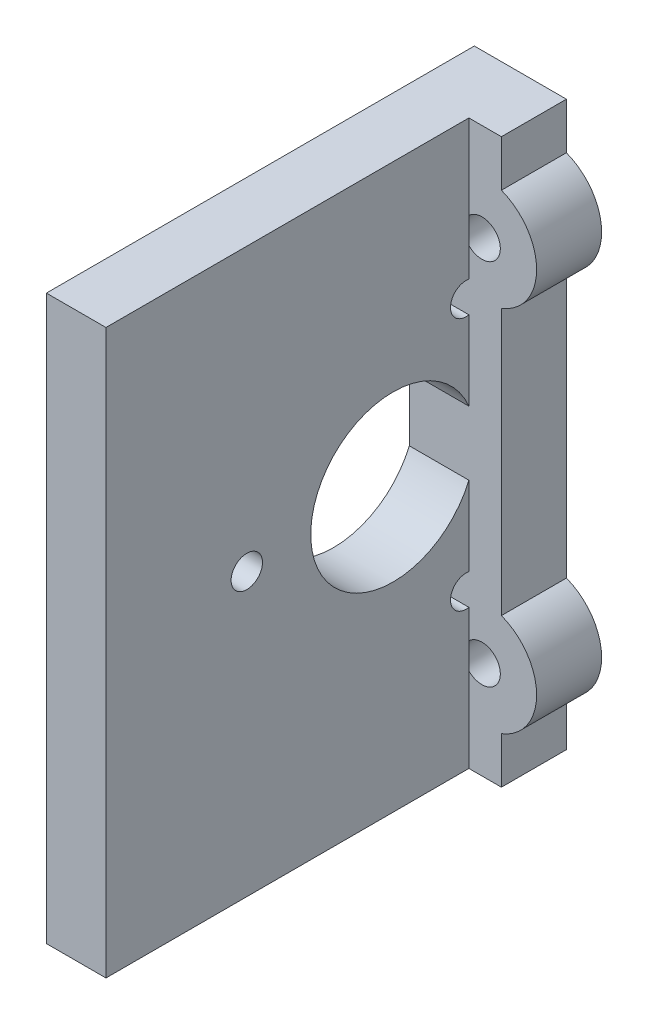
ISO-10303-21;
HEADER;
FILE_DESCRIPTION(('STEP AP214'),'2;1');
FILE_NAME('part.step','',(''),(''),'','','');
FILE_SCHEMA(('AUTOMOTIVE_DESIGN { 1 0 10303 214 1 1 1 1 }'));
ENDSEC;
DATA;
#1=APPLICATION_CONTEXT('core data for automotive mechanical design processes');
#2=APPLICATION_PROTOCOL_DEFINITION('international standard','automotive_design',2000,#1);
#3=PRODUCT_CONTEXT('',#1,'mechanical');
#4=PRODUCT('Part','Part','',(#3));
#5=PRODUCT_RELATED_PRODUCT_CATEGORY('part','',(#4));
#6=PRODUCT_DEFINITION_FORMATION('','',#4);
#7=PRODUCT_DEFINITION_CONTEXT('part definition',#1,'design');
#8=PRODUCT_DEFINITION('design','',#6,#7);
#9=PRODUCT_DEFINITION_SHAPE('','',#8);
#10=(LENGTH_UNIT() NAMED_UNIT(*) SI_UNIT(.MILLI.,.METRE.));
#11=(NAMED_UNIT(*) PLANE_ANGLE_UNIT() SI_UNIT($,.RADIAN.));
#12=(NAMED_UNIT(*) SI_UNIT($,.STERADIAN.) SOLID_ANGLE_UNIT());
#13=UNCERTAINTY_MEASURE_WITH_UNIT(LENGTH_MEASURE(1.E-05),#10,'distance_accuracy_value','');
#14=(GEOMETRIC_REPRESENTATION_CONTEXT(3) GLOBAL_UNCERTAINTY_ASSIGNED_CONTEXT((#13)) GLOBAL_UNIT_ASSIGNED_CONTEXT((#10,
#11,#12)) REPRESENTATION_CONTEXT('',''));
#15=CARTESIAN_POINT('',(0.,0.,0.));
#16=DIRECTION('',(0.,0.,1.));
#17=DIRECTION('',(1.,0.,0.));
#18=AXIS2_PLACEMENT_3D('',#15,#16,#17);
#19=CARTESIAN_POINT('',(272.5,274.,293.));
#20=DIRECTION('',(-1.,0.,0.));
#21=DIRECTION('',(0.,0.,1.));
#22=AXIS2_PLACEMENT_3D('',#19,#20,#21);
#23=PLANE('',#22);
#24=DIRECTION('',(0.,0.,-1.));
#25=VECTOR('',#24,1.);
#26=CARTESIAN_POINT('',(272.5,321.718315377335,293.));
#27=LINE('',#26,#25);
#28=CARTESIAN_POINT('',(272.5,321.718315377335,287.));
#29=VERTEX_POINT('',#28);
#30=CARTESIAN_POINT('',(272.5,321.718315377335,293.));
#31=VERTEX_POINT('',#30);
#32=EDGE_CURVE('E290',#29,#31,#27,.F.);
#33=ORIENTED_EDGE('',*,*,#32,.F.);
#34=DIRECTION('',(0.,1.,0.));
#35=VECTOR('',#34,1.);
#36=CARTESIAN_POINT('',(272.5,274.,287.));
#37=LINE('',#36,#35);
#38=CARTESIAN_POINT('',(272.5,326.,287.));
#39=VERTEX_POINT('',#38);
#40=EDGE_CURVE('E285',#29,#39,#37,.T.);
#41=ORIENTED_EDGE('',*,*,#40,.T.);
#42=DIRECTION('',(0.,0.,-1.));
#43=VECTOR('',#42,1.);
#44=CARTESIAN_POINT('',(272.5,326.,293.));
#45=LINE('',#44,#43);
#46=CARTESIAN_POINT('',(272.5,326.,293.));
#47=VERTEX_POINT('',#46);
#48=EDGE_CURVE('E304',#47,#39,#45,.T.);
#49=ORIENTED_EDGE('',*,*,#48,.F.);
#50=DIRECTION('',(0.,1.,0.));
#51=VECTOR('',#50,1.);
#52=CARTESIAN_POINT('',(272.5,274.,293.));
#53=LINE('',#52,#51);
#54=EDGE_CURVE('E302',#31,#47,#53,.T.);
#55=ORIENTED_EDGE('',*,*,#54,.F.);
#56=EDGE_LOOP('',(#33,#41,#49,#55));
#57=FACE_BOUND('',#56,.T.);
#58=ADVANCED_FACE('F39',(#57),#23,.F.);
#59=DIRECTION('',(0.,0.,-1.));
#60=VECTOR('',#59,1.);
#61=CARTESIAN_POINT('',(272.5,312.281684622665,293.));
#62=LINE('',#61,#60);
#63=CARTESIAN_POINT('',(272.5,312.281684622665,293.));
#64=VERTEX_POINT('',#63);
#65=CARTESIAN_POINT('',(272.5,312.281684622665,287.));
#66=VERTEX_POINT('',#65);
#67=EDGE_CURVE('E323',#64,#66,#62,.T.);
#68=ORIENTED_EDGE('',*,*,#67,.F.);
#69=CARTESIAN_POINT('',(272.5,287.718315377335,293.));
#70=VERTEX_POINT('',#69);
#71=EDGE_CURVE('E281',#70,#64,#53,.T.);
#72=ORIENTED_EDGE('',*,*,#71,.F.);
#73=DIRECTION('',(0.,0.,-1.));
#74=VECTOR('',#73,1.);
#75=CARTESIAN_POINT('',(272.5,287.718315377335,293.));
#76=LINE('',#75,#74);
#77=CARTESIAN_POINT('',(272.5,287.718315377335,287.));
#78=VERTEX_POINT('',#77);
#79=EDGE_CURVE('E168',#78,#70,#76,.F.);
#80=ORIENTED_EDGE('',*,*,#79,.F.);
#81=EDGE_CURVE('E287',#78,#66,#37,.T.);
#82=ORIENTED_EDGE('',*,*,#81,.T.);
#83=EDGE_LOOP('',(#68,#72,#80,#82));
#84=FACE_BOUND('',#83,.T.);
#85=ADVANCED_FACE('F322',(#84),#23,.F.);
#86=DIRECTION('',(0.,0.,-1.));
#87=VECTOR('',#86,1.);
#88=CARTESIAN_POINT('',(272.5,278.281684622665,293.));
#89=LINE('',#88,#87);
#90=CARTESIAN_POINT('',(272.5,278.281684622665,293.));
#91=VERTEX_POINT('',#90);
#92=CARTESIAN_POINT('',(272.5,278.281684622665,287.));
#93=VERTEX_POINT('',#92);
#94=EDGE_CURVE('E264',#91,#93,#89,.T.);
#95=ORIENTED_EDGE('',*,*,#94,.F.);
#96=CARTESIAN_POINT('',(272.5,274.,293.));
#97=VERTEX_POINT('',#96);
#98=EDGE_CURVE('E284',#97,#91,#53,.T.);
#99=ORIENTED_EDGE('',*,*,#98,.F.);
#100=DIRECTION('',(0.,0.,-1.));
#101=VECTOR('',#100,1.);
#102=CARTESIAN_POINT('',(272.5,274.,293.));
#103=LINE('',#102,#101);
#104=CARTESIAN_POINT('',(272.5,274.,287.));
#105=VERTEX_POINT('',#104);
#106=EDGE_CURVE('E196',#97,#105,#103,.T.);
#107=ORIENTED_EDGE('',*,*,#106,.T.);
#108=EDGE_CURVE('E289',#105,#93,#37,.T.);
#109=ORIENTED_EDGE('',*,*,#108,.T.);
#110=EDGE_LOOP('',(#95,#99,#107,#109));
#111=FACE_BOUND('',#110,.T.);
#112=ADVANCED_FACE('F312',(#111),#23,.F.);
#113=CARTESIAN_POINT('',(269.5,0.,0.));
#114=DIRECTION('',(-1.,0.,0.));
#115=DIRECTION('',(0.,0.,1.));
#116=AXIS2_PLACEMENT_3D('',#113,#114,#115);
#117=PLANE('',#116);
#118=CARTESIAN_POINT('',(269.5,300.,313.5));
#119=DIRECTION('',(1.,0.,0.));
#120=DIRECTION('',(0.,0.,-1.));
#121=AXIS2_PLACEMENT_3D('',#118,#119,#120);
#122=CIRCLE('',#121,1.45000000000001);
#123=CARTESIAN_POINT('',(269.5,300.,312.05));
#124=VERTEX_POINT('',#123);
#125=EDGE_CURVE('E226',#124,#124,#122,.T.);
#126=ORIENTED_EDGE('',*,*,#125,.F.);
#127=EDGE_LOOP('',(#126));
#128=FACE_BOUND('',#127,.T.);
#129=DIRECTION('',(0.,0.,-1.));
#130=VECTOR('',#129,1.);
#131=CARTESIAN_POINT('',(269.5,274.,287.));
#132=LINE('',#131,#130);
#133=CARTESIAN_POINT('',(269.5,274.,326.5));
#134=VERTEX_POINT('',#133);
#135=CARTESIAN_POINT('',(269.5,274.,293.));
#136=VERTEX_POINT('',#135);
#137=EDGE_CURVE('E237',#134,#136,#132,.T.);
#138=ORIENTED_EDGE('',*,*,#137,.T.);
#139=DIRECTION('',(0.,1.,0.));
#140=VECTOR('',#139,1.);
#141=CARTESIAN_POINT('',(269.5,0.,293.));
#142=LINE('',#141,#140);
#143=CARTESIAN_POINT('',(269.5,281.795840542121,293.));
#144=VERTEX_POINT('',#143);
#145=EDGE_CURVE('E190',#136,#144,#142,.T.);
#146=ORIENTED_EDGE('',*,*,#145,.T.);
#147=CARTESIAN_POINT('',(269.5,284.204159457879,293.));
#148=VERTEX_POINT('',#147);
#149=EDGE_CURVE('E185',#144,#148,#142,.T.);
#150=ORIENTED_EDGE('',*,*,#149,.T.);
#151=CARTESIAN_POINT('',(269.5,286.880371363202,293.));
#152=VERTEX_POINT('',#151);
#153=EDGE_CURVE('E197',#148,#152,#142,.T.);
#154=ORIENTED_EDGE('',*,*,#153,.T.);
#155=CARTESIAN_POINT('',(269.5,288.30865704891,293.25));
#156=DIRECTION('',(1.,0.,0.));
#157=DIRECTION('',(0.,0.,-1.));
#158=AXIS2_PLACEMENT_3D('',#155,#156,#157);
#159=CIRCLE('',#158,1.45000000000001);
#160=CARTESIAN_POINT('',(269.5,289.736942734619,293.));
#161=VERTEX_POINT('',#160);
#162=EDGE_CURVE('E214',#161,#152,#159,.T.);
#163=ORIENTED_EDGE('',*,*,#162,.F.);
#164=CARTESIAN_POINT('',(269.5,297.04027028261,293.));
#165=VERTEX_POINT('',#164);
#166=EDGE_CURVE('E191',#161,#165,#142,.T.);
#167=ORIENTED_EDGE('',*,*,#166,.T.);
#168=CARTESIAN_POINT('',(269.5,300.,300.));
#169=DIRECTION('',(1.,0.,0.));
#170=DIRECTION('',(0.,0.,-1.));
#171=AXIS2_PLACEMENT_3D('',#168,#169,#170);
#172=CIRCLE('',#171,7.6);
#173=CARTESIAN_POINT('',(269.5,302.95972971739,293.));
#174=VERTEX_POINT('',#173);
#175=EDGE_CURVE('E209',#174,#165,#172,.T.);
#176=ORIENTED_EDGE('',*,*,#175,.F.);
#177=CARTESIAN_POINT('',(269.5,310.263057265381,293.));
#178=VERTEX_POINT('',#177);
#179=EDGE_CURVE('E198',#174,#178,#142,.T.);
#180=ORIENTED_EDGE('',*,*,#179,.T.);
#181=CARTESIAN_POINT('',(269.5,311.69134295109,293.25));
#182=DIRECTION('',(1.,0.,0.));
#183=DIRECTION('',(0.,0.,-1.));
#184=AXIS2_PLACEMENT_3D('',#181,#182,#183);
#185=CIRCLE('',#184,1.45000000000001);
#186=CARTESIAN_POINT('',(269.5,313.119628636799,293.));
#187=VERTEX_POINT('',#186);
#188=EDGE_CURVE('E220',#187,#178,#185,.T.);
#189=ORIENTED_EDGE('',*,*,#188,.F.);
#190=CARTESIAN_POINT('',(269.5,315.795840542121,293.));
#191=VERTEX_POINT('',#190);
#192=EDGE_CURVE('E188',#187,#191,#142,.T.);
#193=ORIENTED_EDGE('',*,*,#192,.T.);
#194=CARTESIAN_POINT('',(269.5,318.204159457879,293.));
#195=VERTEX_POINT('',#194);
#196=EDGE_CURVE('E172',#191,#195,#142,.T.);
#197=ORIENTED_EDGE('',*,*,#196,.T.);
#198=CARTESIAN_POINT('',(269.5,326.,293.));
#199=VERTEX_POINT('',#198);
#200=EDGE_CURVE('E176',#195,#199,#142,.T.);
#201=ORIENTED_EDGE('',*,*,#200,.T.);
#202=DIRECTION('',(0.,0.,1.));
#203=VECTOR('',#202,1.);
#204=CARTESIAN_POINT('',(269.5,326.,326.5));
#205=LINE('',#204,#203);
#206=CARTESIAN_POINT('',(269.5,326.,326.5));
#207=VERTEX_POINT('',#206);
#208=EDGE_CURVE('E232',#199,#207,#205,.T.);
#209=ORIENTED_EDGE('',*,*,#208,.T.);
#210=DIRECTION('',(0.,-1.,0.));
#211=VECTOR('',#210,1.);
#212=CARTESIAN_POINT('',(269.5,274.,326.5));
#213=LINE('',#212,#211);
#214=EDGE_CURVE('E234',#207,#134,#213,.T.);
#215=ORIENTED_EDGE('',*,*,#214,.T.);
#216=EDGE_LOOP('',(#138,#146,#150,#154,#163,#167,#176,#180,#189,#193,#197,#201,#209,#215));
#217=FACE_BOUND('',#216,.T.);
#218=ADVANCED_FACE('F186',(#128,#217),#117,.F.);
#219=CARTESIAN_POINT('',(264.,0.,0.));
#220=DIRECTION('',(-1.,0.,0.));
#221=DIRECTION('',(0.,0.,1.));
#222=AXIS2_PLACEMENT_3D('',#219,#220,#221);
#223=PLANE('',#222);
#224=CARTESIAN_POINT('',(264.,288.30865704891,293.25));
#225=DIRECTION('',(1.,0.,0.));
#226=DIRECTION('',(0.,0.,-1.));
#227=AXIS2_PLACEMENT_3D('',#224,#225,#226);
#228=CIRCLE('',#227,1.45000000000001);
#229=CARTESIAN_POINT('',(264.,289.736942734619,293.));
#230=VERTEX_POINT('',#229);
#231=CARTESIAN_POINT('',(264.,286.880371363202,293.));
#232=VERTEX_POINT('',#231);
#233=EDGE_CURVE('E211',#230,#232,#228,.T.);
#234=ORIENTED_EDGE('',*,*,#233,.T.);
#235=DIRECTION('',(0.,-1.,0.));
#236=VECTOR('',#235,1.);
#237=CARTESIAN_POINT('',(264.,326.,293.));
#238=LINE('',#237,#236);
#239=EDGE_CURVE('E295',#230,#232,#238,.T.);
#240=ORIENTED_EDGE('',*,*,#239,.F.);
#241=EDGE_LOOP('',(#234,#240));
#242=FACE_BOUND('',#241,.T.);
#243=CARTESIAN_POINT('',(264.,300.,300.));
#244=DIRECTION('',(1.,0.,0.));
#245=DIRECTION('',(0.,0.,-1.));
#246=AXIS2_PLACEMENT_3D('',#243,#244,#245);
#247=CIRCLE('',#246,7.6);
#248=CARTESIAN_POINT('',(264.,302.95972971739,293.));
#249=VERTEX_POINT('',#248);
#250=CARTESIAN_POINT('',(264.,297.04027028261,293.));
#251=VERTEX_POINT('',#250);
#252=EDGE_CURVE('E189',#249,#251,#247,.T.);
#253=ORIENTED_EDGE('',*,*,#252,.T.);
#254=EDGE_CURVE('E298',#249,#251,#238,.T.);
#255=ORIENTED_EDGE('',*,*,#254,.F.);
#256=EDGE_LOOP('',(#253,#255));
#257=FACE_BOUND('',#256,.T.);
#258=CARTESIAN_POINT('',(264.,311.69134295109,293.25));
#259=DIRECTION('',(1.,0.,0.));
#260=DIRECTION('',(0.,0.,-1.));
#261=AXIS2_PLACEMENT_3D('',#258,#259,#260);
#262=CIRCLE('',#261,1.45000000000001);
#263=CARTESIAN_POINT('',(264.,313.119628636799,293.));
#264=VERTEX_POINT('',#263);
#265=CARTESIAN_POINT('',(264.,310.263057265381,293.));
#266=VERTEX_POINT('',#265);
#267=EDGE_CURVE('E217',#264,#266,#262,.T.);
#268=ORIENTED_EDGE('',*,*,#267,.T.);
#269=EDGE_CURVE('E299',#264,#266,#238,.T.);
#270=ORIENTED_EDGE('',*,*,#269,.F.);
#271=EDGE_LOOP('',(#268,#270));
#272=FACE_BOUND('',#271,.T.);
#273=DIRECTION('',(0.,1.,0.));
#274=VECTOR('',#273,1.);
#275=CARTESIAN_POINT('',(264.,326.,287.));
#276=LINE('',#275,#274);
#277=CARTESIAN_POINT('',(264.,274.,287.));
#278=VERTEX_POINT('',#277);
#279=CARTESIAN_POINT('',(264.,326.,287.));
#280=VERTEX_POINT('',#279);
#281=EDGE_CURVE('E229',#278,#280,#276,.T.);
#282=ORIENTED_EDGE('',*,*,#281,.F.);
#283=DIRECTION('',(0.,0.,-1.));
#284=VECTOR('',#283,1.);
#285=CARTESIAN_POINT('',(264.,274.,287.));
#286=LINE('',#285,#284);
#287=CARTESIAN_POINT('',(264.,274.,326.5));
#288=VERTEX_POINT('',#287);
#289=EDGE_CURVE('E235',#288,#278,#286,.T.);
#290=ORIENTED_EDGE('',*,*,#289,.F.);
#291=DIRECTION('',(0.,-1.,0.));
#292=VECTOR('',#291,1.);
#293=CARTESIAN_POINT('',(264.,274.,326.5));
#294=LINE('',#293,#292);
#295=CARTESIAN_POINT('',(264.,326.,326.5));
#296=VERTEX_POINT('',#295);
#297=EDGE_CURVE('E244',#296,#288,#294,.T.);
#298=ORIENTED_EDGE('',*,*,#297,.F.);
#299=DIRECTION('',(0.,0.,1.));
#300=VECTOR('',#299,1.);
#301=CARTESIAN_POINT('',(264.,326.,326.5));
#302=LINE('',#301,#300);
#303=EDGE_CURVE('E242',#280,#296,#302,.T.);
#304=ORIENTED_EDGE('',*,*,#303,.F.);
#305=EDGE_LOOP('',(#282,#290,#298,#304));
#306=FACE_BOUND('',#305,.T.);
#307=CARTESIAN_POINT('',(264.,300.,313.5));
#308=DIRECTION('',(1.,0.,0.));
#309=DIRECTION('',(0.,0.,-1.));
#310=AXIS2_PLACEMENT_3D('',#307,#308,#309);
#311=CIRCLE('',#310,1.45000000000001);
#312=CARTESIAN_POINT('',(264.,300.,312.05));
#313=VERTEX_POINT('',#312);
#314=EDGE_CURVE('E223',#313,#313,#311,.T.);
#315=ORIENTED_EDGE('',*,*,#314,.T.);
#316=EDGE_LOOP('',(#315));
#317=FACE_BOUND('',#316,.T.);
#318=ADVANCED_FACE('F365',(#242,#257,#272,#306,#317),#223,.T.);
#319=CARTESIAN_POINT('',(269.5,326.,287.));
#320=DIRECTION('',(0.,0.,1.));
#321=DIRECTION('',(1.,0.,0.));
#322=AXIS2_PLACEMENT_3D('',#319,#320,#321);
#323=PLANE('',#322);
#324=CARTESIAN_POINT('',(270.7,283.,287.));
#325=DIRECTION('',(0.,0.,1.));
#326=DIRECTION('',(1.,0.,0.));
#327=AXIS2_PLACEMENT_3D('',#324,#325,#326);
#328=CIRCLE('',#327,1.69999999999998);
#329=CARTESIAN_POINT('',(272.4,283.,287.));
#330=VERTEX_POINT('',#329);
#331=EDGE_CURVE('E333',#330,#330,#328,.T.);
#332=ORIENTED_EDGE('',*,*,#331,.T.);
#333=EDGE_LOOP('',(#332));
#334=FACE_BOUND('',#333,.T.);
#335=CARTESIAN_POINT('',(270.7,317.,287.));
#336=DIRECTION('',(0.,0.,1.));
#337=DIRECTION('',(1.,0.,0.));
#338=AXIS2_PLACEMENT_3D('',#335,#336,#337);
#339=CIRCLE('',#338,1.69999999999998);
#340=CARTESIAN_POINT('',(272.4,317.,287.));
#341=VERTEX_POINT('',#340);
#342=EDGE_CURVE('E173',#341,#341,#339,.T.);
#343=ORIENTED_EDGE('',*,*,#342,.T.);
#344=EDGE_LOOP('',(#343));
#345=FACE_BOUND('',#344,.T.);
#346=ORIENTED_EDGE('',*,*,#40,.F.);
#347=CARTESIAN_POINT('',(270.7,317.,287.));
#348=DIRECTION('',(0.,0.,1.));
#349=DIRECTION('',(1.,0.,0.));
#350=AXIS2_PLACEMENT_3D('',#347,#348,#349);
#351=CIRCLE('',#350,5.05);
#352=EDGE_CURVE('E320',#66,#29,#351,.T.);
#353=ORIENTED_EDGE('',*,*,#352,.F.);
#354=ORIENTED_EDGE('',*,*,#81,.F.);
#355=CARTESIAN_POINT('',(270.7,283.,287.));
#356=DIRECTION('',(0.,0.,1.));
#357=DIRECTION('',(1.,0.,0.));
#358=AXIS2_PLACEMENT_3D('',#355,#356,#357);
#359=CIRCLE('',#358,5.05);
#360=EDGE_CURVE('E275',#93,#78,#359,.T.);
#361=ORIENTED_EDGE('',*,*,#360,.F.);
#362=ORIENTED_EDGE('',*,*,#108,.F.);
#363=DIRECTION('',(-1.,0.,0.));
#364=VECTOR('',#363,1.);
#365=CARTESIAN_POINT('',(269.5,274.,287.));
#366=LINE('',#365,#364);
#367=EDGE_CURVE('E239',#105,#278,#366,.T.);
#368=ORIENTED_EDGE('',*,*,#367,.T.);
#369=ORIENTED_EDGE('',*,*,#281,.T.);
#370=DIRECTION('',(-1.,0.,0.));
#371=VECTOR('',#370,1.);
#372=CARTESIAN_POINT('',(269.5,326.,287.));
#373=LINE('',#372,#371);
#374=EDGE_CURVE('E255',#39,#280,#373,.T.);
#375=ORIENTED_EDGE('',*,*,#374,.F.);
#376=EDGE_LOOP('',(#346,#353,#354,#361,#362,#368,#369,#375));
#377=FACE_BOUND('',#376,.T.);
#378=ADVANCED_FACE('F41',(#334,#345,#377),#323,.F.);
#379=CARTESIAN_POINT('',(269.5,326.,326.5));
#380=DIRECTION('',(0.,-1.,0.));
#381=DIRECTION('',(0.,0.,-1.));
#382=AXIS2_PLACEMENT_3D('',#379,#380,#381);
#383=PLANE('',#382);
#384=ORIENTED_EDGE('',*,*,#208,.F.);
#385=DIRECTION('',(-1.,0.,0.));
#386=VECTOR('',#385,1.);
#387=CARTESIAN_POINT('',(272.5,326.,293.));
#388=LINE('',#387,#386);
#389=EDGE_CURVE('E180',#47,#199,#388,.T.);
#390=ORIENTED_EDGE('',*,*,#389,.F.);
#391=ORIENTED_EDGE('',*,*,#48,.T.);
#392=ORIENTED_EDGE('',*,*,#374,.T.);
#393=ORIENTED_EDGE('',*,*,#303,.T.);
#394=DIRECTION('',(-1.,0.,0.));
#395=VECTOR('',#394,1.);
#396=CARTESIAN_POINT('',(269.5,326.,326.5));
#397=LINE('',#396,#395);
#398=EDGE_CURVE('E252',#207,#296,#397,.T.);
#399=ORIENTED_EDGE('',*,*,#398,.F.);
#400=EDGE_LOOP('',(#384,#390,#391,#392,#393,#399));
#401=FACE_BOUND('',#400,.T.);
#402=ADVANCED_FACE('F385',(#401),#383,.F.);
#403=CARTESIAN_POINT('',(269.5,274.,326.5));
#404=DIRECTION('',(0.,0.,-1.));
#405=DIRECTION('',(-1.,0.,0.));
#406=AXIS2_PLACEMENT_3D('',#403,#404,#405);
#407=PLANE('',#406);
#408=ORIENTED_EDGE('',*,*,#297,.T.);
#409=DIRECTION('',(-1.,0.,0.));
#410=VECTOR('',#409,1.);
#411=CARTESIAN_POINT('',(269.5,274.,326.5));
#412=LINE('',#411,#410);
#413=EDGE_CURVE('E249',#134,#288,#412,.T.);
#414=ORIENTED_EDGE('',*,*,#413,.F.);
#415=ORIENTED_EDGE('',*,*,#214,.F.);
#416=ORIENTED_EDGE('',*,*,#398,.T.);
#417=EDGE_LOOP('',(#408,#414,#415,#416));
#418=FACE_BOUND('',#417,.T.);
#419=ADVANCED_FACE('F383',(#418),#407,.F.);
#420=CARTESIAN_POINT('',(269.5,274.,287.));
#421=DIRECTION('',(0.,1.,0.));
#422=DIRECTION('',(0.,0.,1.));
#423=AXIS2_PLACEMENT_3D('',#420,#421,#422);
#424=PLANE('',#423);
#425=ORIENTED_EDGE('',*,*,#289,.T.);
#426=ORIENTED_EDGE('',*,*,#367,.F.);
#427=ORIENTED_EDGE('',*,*,#106,.F.);
#428=DIRECTION('',(1.,0.,0.));
#429=VECTOR('',#428,1.);
#430=CARTESIAN_POINT('',(264.,274.,293.));
#431=LINE('',#430,#429);
#432=EDGE_CURVE('E300',#136,#97,#431,.T.);
#433=ORIENTED_EDGE('',*,*,#432,.F.);
#434=ORIENTED_EDGE('',*,*,#137,.F.);
#435=ORIENTED_EDGE('',*,*,#413,.T.);
#436=EDGE_LOOP('',(#425,#426,#427,#433,#434,#435));
#437=FACE_BOUND('',#436,.T.);
#438=ADVANCED_FACE('F380',(#437),#424,.F.);
#439=CARTESIAN_POINT('',(269.5,300.,313.5));
#440=DIRECTION('',(-1.,0.,0.));
#441=DIRECTION('',(0.,0.,1.));
#442=AXIS2_PLACEMENT_3D('',#439,#440,#441);
#443=CYLINDRICAL_SURFACE('',#442,1.45000000000001);
#444=ORIENTED_EDGE('',*,*,#125,.T.);
#445=EDGE_LOOP('',(#444));
#446=FACE_BOUND('',#445,.T.);
#447=ORIENTED_EDGE('',*,*,#314,.F.);
#448=EDGE_LOOP('',(#447));
#449=FACE_BOUND('',#448,.T.);
#450=ADVANCED_FACE('F377',(#446,#449),#443,.F.);
#451=CARTESIAN_POINT('',(269.5,311.69134295109,293.25));
#452=DIRECTION('',(-1.,0.,0.));
#453=DIRECTION('',(0.,0.,1.));
#454=AXIS2_PLACEMENT_3D('',#451,#452,#453);
#455=CYLINDRICAL_SURFACE('',#454,1.45000000000001);
#456=DIRECTION('',(-1.,0.,0.));
#457=VECTOR('',#456,1.);
#458=CARTESIAN_POINT('',(269.5,313.119628636799,293.));
#459=LINE('',#458,#457);
#460=EDGE_CURVE('E183',#187,#264,#459,.T.);
#461=ORIENTED_EDGE('',*,*,#460,.F.);
#462=ORIENTED_EDGE('',*,*,#188,.T.);
#463=DIRECTION('',(-1.,0.,0.));
#464=VECTOR('',#463,1.);
#465=CARTESIAN_POINT('',(269.5,310.263057265381,293.));
#466=LINE('',#465,#464);
#467=EDGE_CURVE('E202',#266,#178,#466,.F.);
#468=ORIENTED_EDGE('',*,*,#467,.F.);
#469=ORIENTED_EDGE('',*,*,#267,.F.);
#470=EDGE_LOOP('',(#461,#462,#468,#469));
#471=FACE_BOUND('',#470,.T.);
#472=ADVANCED_FACE('F402',(#471),#455,.F.);
#473=CARTESIAN_POINT('',(269.5,288.30865704891,293.25));
#474=DIRECTION('',(-1.,0.,0.));
#475=DIRECTION('',(0.,0.,1.));
#476=AXIS2_PLACEMENT_3D('',#473,#474,#475);
#477=CYLINDRICAL_SURFACE('',#476,1.45000000000001);
#478=DIRECTION('',(-1.,0.,0.));
#479=VECTOR('',#478,1.);
#480=CARTESIAN_POINT('',(269.5,289.736942734619,293.));
#481=LINE('',#480,#479);
#482=EDGE_CURVE('E195',#161,#230,#481,.T.);
#483=ORIENTED_EDGE('',*,*,#482,.F.);
#484=ORIENTED_EDGE('',*,*,#162,.T.);
#485=DIRECTION('',(-1.,0.,0.));
#486=VECTOR('',#485,1.);
#487=CARTESIAN_POINT('',(269.5,286.880371363202,293.));
#488=LINE('',#487,#486);
#489=EDGE_CURVE('E205',#232,#152,#488,.F.);
#490=ORIENTED_EDGE('',*,*,#489,.F.);
#491=ORIENTED_EDGE('',*,*,#233,.F.);
#492=EDGE_LOOP('',(#483,#484,#490,#491));
#493=FACE_BOUND('',#492,.T.);
#494=ADVANCED_FACE('F416',(#493),#477,.F.);
#495=CARTESIAN_POINT('',(269.5,300.,300.));
#496=DIRECTION('',(-1.,0.,0.));
#497=DIRECTION('',(0.,0.,1.));
#498=AXIS2_PLACEMENT_3D('',#495,#496,#497);
#499=CYLINDRICAL_SURFACE('',#498,7.6);
#500=DIRECTION('',(-1.,0.,0.));
#501=VECTOR('',#500,1.);
#502=CARTESIAN_POINT('',(269.5,302.95972971739,293.));
#503=LINE('',#502,#501);
#504=EDGE_CURVE('E261',#174,#249,#503,.T.);
#505=ORIENTED_EDGE('',*,*,#504,.F.);
#506=ORIENTED_EDGE('',*,*,#175,.T.);
#507=DIRECTION('',(-1.,0.,0.));
#508=VECTOR('',#507,1.);
#509=CARTESIAN_POINT('',(269.5,297.04027028261,293.));
#510=LINE('',#509,#508);
#511=EDGE_CURVE('E258',#251,#165,#510,.F.);
#512=ORIENTED_EDGE('',*,*,#511,.F.);
#513=ORIENTED_EDGE('',*,*,#252,.F.);
#514=EDGE_LOOP('',(#505,#506,#512,#513));
#515=FACE_BOUND('',#514,.T.);
#516=ADVANCED_FACE('F412',(#515),#499,.F.);
#517=CARTESIAN_POINT('',(0.,0.,293.));
#518=DIRECTION('',(0.,0.,1.));
#519=DIRECTION('',(1.,0.,0.));
#520=AXIS2_PLACEMENT_3D('',#517,#518,#519);
#521=PLANE('',#520);
#522=ORIENTED_EDGE('',*,*,#153,.F.);
#523=CARTESIAN_POINT('',(270.7,283.,293.));
#524=DIRECTION('',(0.,0.,1.));
#525=DIRECTION('',(1.,0.,0.));
#526=AXIS2_PLACEMENT_3D('',#523,#524,#525);
#527=CIRCLE('',#526,1.69999999999998);
#528=EDGE_CURVE('E11',#148,#144,#527,.F.);
#529=ORIENTED_EDGE('',*,*,#528,.T.);
#530=ORIENTED_EDGE('',*,*,#145,.F.);
#531=ORIENTED_EDGE('',*,*,#432,.T.);
#532=ORIENTED_EDGE('',*,*,#98,.T.);
#533=CARTESIAN_POINT('',(270.7,283.,293.));
#534=DIRECTION('',(0.,0.,1.));
#535=DIRECTION('',(1.,0.,0.));
#536=AXIS2_PLACEMENT_3D('',#533,#534,#535);
#537=CIRCLE('',#536,5.05);
#538=EDGE_CURVE('E273',#91,#70,#537,.T.);
#539=ORIENTED_EDGE('',*,*,#538,.T.);
#540=ORIENTED_EDGE('',*,*,#71,.T.);
#541=CARTESIAN_POINT('',(270.7,317.,293.));
#542=DIRECTION('',(0.,0.,1.));
#543=DIRECTION('',(1.,0.,0.));
#544=AXIS2_PLACEMENT_3D('',#541,#542,#543);
#545=CIRCLE('',#544,5.05);
#546=EDGE_CURVE('E327',#64,#31,#545,.T.);
#547=ORIENTED_EDGE('',*,*,#546,.T.);
#548=ORIENTED_EDGE('',*,*,#54,.T.);
#549=ORIENTED_EDGE('',*,*,#389,.T.);
#550=ORIENTED_EDGE('',*,*,#200,.F.);
#551=CARTESIAN_POINT('',(270.7,317.,293.));
#552=DIRECTION('',(0.,0.,1.));
#553=DIRECTION('',(1.,0.,0.));
#554=AXIS2_PLACEMENT_3D('',#551,#552,#553);
#555=CIRCLE('',#554,1.69999999999998);
#556=EDGE_CURVE('E47',#195,#191,#555,.F.);
#557=ORIENTED_EDGE('',*,*,#556,.T.);
#558=ORIENTED_EDGE('',*,*,#192,.F.);
#559=ORIENTED_EDGE('',*,*,#460,.T.);
#560=ORIENTED_EDGE('',*,*,#269,.T.);
#561=ORIENTED_EDGE('',*,*,#467,.T.);
#562=ORIENTED_EDGE('',*,*,#179,.F.);
#563=ORIENTED_EDGE('',*,*,#504,.T.);
#564=ORIENTED_EDGE('',*,*,#254,.T.);
#565=ORIENTED_EDGE('',*,*,#511,.T.);
#566=ORIENTED_EDGE('',*,*,#166,.F.);
#567=ORIENTED_EDGE('',*,*,#482,.T.);
#568=ORIENTED_EDGE('',*,*,#239,.T.);
#569=ORIENTED_EDGE('',*,*,#489,.T.);
#570=EDGE_LOOP('',(#522,#529,#530,#531,#532,#539,#540,#547,#548,#549,#550,#557,#558,#559,#560,
#561,#562,#563,#564,#565,#566,#567,#568,#569));
#571=FACE_BOUND('',#570,.T.);
#572=ADVANCED_FACE('F178',(#571),#521,.T.);
#573=CARTESIAN_POINT('',(270.7,283.,293.));
#574=DIRECTION('',(0.,0.,-1.));
#575=DIRECTION('',(-1.,0.,0.));
#576=AXIS2_PLACEMENT_3D('',#573,#574,#575);
#577=CYLINDRICAL_SURFACE('',#576,5.05);
#578=ORIENTED_EDGE('',*,*,#360,.T.);
#579=ORIENTED_EDGE('',*,*,#79,.T.);
#580=ORIENTED_EDGE('',*,*,#538,.F.);
#581=ORIENTED_EDGE('',*,*,#94,.T.);
#582=EDGE_LOOP('',(#578,#579,#580,#581));
#583=FACE_BOUND('',#582,.T.);
#584=ADVANCED_FACE('F272',(#583),#577,.T.);
#585=CARTESIAN_POINT('',(270.7,317.,293.));
#586=DIRECTION('',(0.,0.,-1.));
#587=DIRECTION('',(-1.,0.,0.));
#588=AXIS2_PLACEMENT_3D('',#585,#586,#587);
#589=CYLINDRICAL_SURFACE('',#588,5.05);
#590=ORIENTED_EDGE('',*,*,#352,.T.);
#591=ORIENTED_EDGE('',*,*,#32,.T.);
#592=ORIENTED_EDGE('',*,*,#546,.F.);
#593=ORIENTED_EDGE('',*,*,#67,.T.);
#594=EDGE_LOOP('',(#590,#591,#592,#593));
#595=FACE_BOUND('',#594,.T.);
#596=ADVANCED_FACE('F325',(#595),#589,.T.);
#597=CARTESIAN_POINT('',(270.7,317.,293.));
#598=DIRECTION('',(0.,0.,1.));
#599=DIRECTION('',(1.,0.,0.));
#600=AXIS2_PLACEMENT_3D('',#597,#598,#599);
#601=PLANE('',#600);
#602=CARTESIAN_POINT('',(270.7,317.,293.));
#603=DIRECTION('',(0.,0.,1.));
#604=DIRECTION('',(1.,0.,0.));
#605=AXIS2_PLACEMENT_3D('',#602,#603,#604);
#606=CIRCLE('',#605,1.69999999999998);
#607=EDGE_CURVE('E60',#195,#191,#606,.T.);
#608=ORIENTED_EDGE('',*,*,#607,.F.);
#609=ORIENTED_EDGE('',*,*,#196,.F.);
#610=EDGE_LOOP('',(#608,#609));
#611=FACE_BOUND('',#610,.T.);
#612=ADVANCED_FACE('F170',(#611),#601,.F.);
#613=CARTESIAN_POINT('',(270.7,317.,293.));
#614=DIRECTION('',(0.,0.,-1.));
#615=DIRECTION('',(-1.,0.,0.));
#616=AXIS2_PLACEMENT_3D('',#613,#614,#615);
#617=CYLINDRICAL_SURFACE('',#616,1.69999999999998);
#618=ORIENTED_EDGE('',*,*,#607,.T.);
#619=ORIENTED_EDGE('',*,*,#556,.F.);
#620=EDGE_LOOP('',(#618,#619));
#621=FACE_BOUND('',#620,.T.);
#622=ORIENTED_EDGE('',*,*,#342,.F.);
#623=EDGE_LOOP('',(#622));
#624=FACE_BOUND('',#623,.T.);
#625=ADVANCED_FACE('F162',(#621,#624),#617,.F.);
#626=CARTESIAN_POINT('',(270.7,283.,293.));
#627=DIRECTION('',(0.,0.,1.));
#628=DIRECTION('',(1.,0.,0.));
#629=AXIS2_PLACEMENT_3D('',#626,#627,#628);
#630=PLANE('',#629);
#631=CARTESIAN_POINT('',(270.7,283.,293.));
#632=DIRECTION('',(0.,0.,1.));
#633=DIRECTION('',(1.,0.,0.));
#634=AXIS2_PLACEMENT_3D('',#631,#632,#633);
#635=CIRCLE('',#634,1.69999999999998);
#636=EDGE_CURVE('E53',#148,#144,#635,.T.);
#637=ORIENTED_EDGE('',*,*,#636,.F.);
#638=ORIENTED_EDGE('',*,*,#149,.F.);
#639=EDGE_LOOP('',(#637,#638));
#640=FACE_BOUND('',#639,.T.);
#641=ADVANCED_FACE('F342',(#640),#630,.F.);
#642=CARTESIAN_POINT('',(270.7,283.,293.));
#643=DIRECTION('',(0.,0.,-1.));
#644=DIRECTION('',(-1.,0.,0.));
#645=AXIS2_PLACEMENT_3D('',#642,#643,#644);
#646=CYLINDRICAL_SURFACE('',#645,1.69999999999998);
#647=ORIENTED_EDGE('',*,*,#636,.T.);
#648=ORIENTED_EDGE('',*,*,#528,.F.);
#649=EDGE_LOOP('',(#647,#648));
#650=FACE_BOUND('',#649,.T.);
#651=ORIENTED_EDGE('',*,*,#331,.F.);
#652=EDGE_LOOP('',(#651));
#653=FACE_BOUND('',#652,.T.);
#654=ADVANCED_FACE('F340',(#650,#653),#646,.F.);
#655=CLOSED_SHELL('',(#58,#85,#112,#218,#318,#378,#402,#419,#438,#450,#472,#494,#516,#572,#584,
#596,#612,#625,#641,#654));
#656=MANIFOLD_SOLID_BREP('B2',#655);
#657=ADVANCED_BREP_SHAPE_REPRESENTATION('',(#18,#656),#14);
#658=SHAPE_DEFINITION_REPRESENTATION(#9,#657);
ENDSEC;
END-ISO-10303-21;
